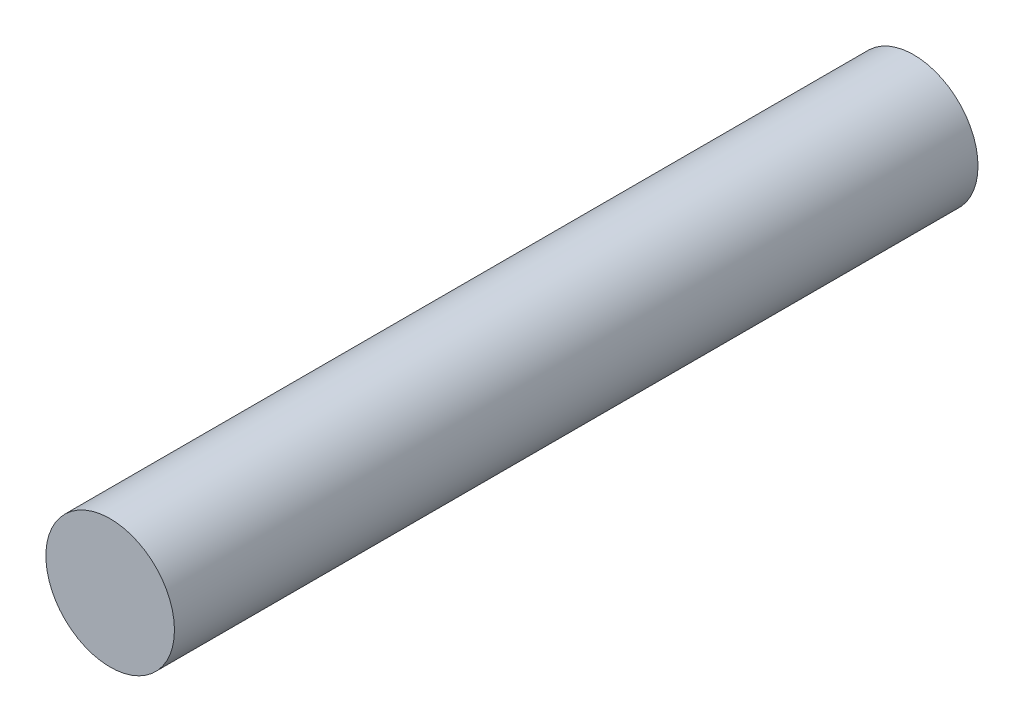
ISO-10303-21;
HEADER;
FILE_DESCRIPTION(('STEP AP214'),'2;1');
FILE_NAME('part.step','',(''),(''),'','','');
FILE_SCHEMA(('AUTOMOTIVE_DESIGN { 1 0 10303 214 1 1 1 1 }'));
ENDSEC;
DATA;
#1=APPLICATION_CONTEXT('core data for automotive mechanical design processes');
#2=APPLICATION_PROTOCOL_DEFINITION('international standard','automotive_design',2000,#1);
#3=PRODUCT_CONTEXT('',#1,'mechanical');
#4=PRODUCT('Part','Part','',(#3));
#5=PRODUCT_RELATED_PRODUCT_CATEGORY('part','',(#4));
#6=PRODUCT_DEFINITION_FORMATION('','',#4);
#7=PRODUCT_DEFINITION_CONTEXT('part definition',#1,'design');
#8=PRODUCT_DEFINITION('design','',#6,#7);
#9=PRODUCT_DEFINITION_SHAPE('','',#8);
#10=(LENGTH_UNIT() NAMED_UNIT(*) SI_UNIT(.MILLI.,.METRE.));
#11=(NAMED_UNIT(*) PLANE_ANGLE_UNIT() SI_UNIT($,.RADIAN.));
#12=(NAMED_UNIT(*) SI_UNIT($,.STERADIAN.) SOLID_ANGLE_UNIT());
#13=UNCERTAINTY_MEASURE_WITH_UNIT(LENGTH_MEASURE(1.E-05),#10,'distance_accuracy_value','');
#14=(GEOMETRIC_REPRESENTATION_CONTEXT(3) GLOBAL_UNCERTAINTY_ASSIGNED_CONTEXT((#13)) GLOBAL_UNIT_ASSIGNED_CONTEXT((#10,
#11,#12)) REPRESENTATION_CONTEXT('',''));
#15=CARTESIAN_POINT('',(0.,0.,0.));
#16=DIRECTION('',(0.,0.,1.));
#17=DIRECTION('',(1.,0.,0.));
#18=AXIS2_PLACEMENT_3D('',#15,#16,#17);
#19=CARTESIAN_POINT('',(0.,0.,100.));
#20=DIRECTION('',(0.,0.,-1.));
#21=DIRECTION('',(-1.,0.,0.));
#22=AXIS2_PLACEMENT_3D('',#19,#20,#21);
#23=CYLINDRICAL_SURFACE('',#22,8.);
#24=CARTESIAN_POINT('',(0.,0.,100.));
#25=DIRECTION('',(0.,0.,1.));
#26=DIRECTION('',(1.,0.,0.));
#27=AXIS2_PLACEMENT_3D('',#24,#25,#26);
#28=CIRCLE('',#27,8.);
#29=CARTESIAN_POINT('',(8.,0.,100.));
#30=VERTEX_POINT('',#29);
#31=EDGE_CURVE('E10',#30,#30,#28,.T.);
#32=ORIENTED_EDGE('',*,*,#31,.F.);
#33=EDGE_LOOP('',(#32));
#34=FACE_BOUND('',#33,.T.);
#35=CARTESIAN_POINT('',(0.,0.,0.));
#36=DIRECTION('',(0.,0.,1.));
#37=DIRECTION('',(1.,0.,0.));
#38=AXIS2_PLACEMENT_3D('',#35,#36,#37);
#39=CIRCLE('',#38,8.);
#40=CARTESIAN_POINT('',(8.,0.,0.));
#41=VERTEX_POINT('',#40);
#42=EDGE_CURVE('E44',#41,#41,#39,.T.);
#43=ORIENTED_EDGE('',*,*,#42,.T.);
#44=EDGE_LOOP('',(#43));
#45=FACE_BOUND('',#44,.T.);
#46=ADVANCED_FACE('F41',(#34,#45),#23,.T.);
#47=CARTESIAN_POINT('',(0.,0.,100.));
#48=DIRECTION('',(0.,0.,1.));
#49=DIRECTION('',(1.,0.,0.));
#50=AXIS2_PLACEMENT_3D('',#47,#48,#49);
#51=PLANE('',#50);
#52=ORIENTED_EDGE('',*,*,#31,.T.);
#53=EDGE_LOOP('',(#52));
#54=FACE_BOUND('',#53,.T.);
#55=ADVANCED_FACE('F58',(#54),#51,.T.);
#56=CARTESIAN_POINT('',(0.,0.,0.));
#57=DIRECTION('',(0.,0.,1.));
#58=DIRECTION('',(1.,0.,0.));
#59=AXIS2_PLACEMENT_3D('',#56,#57,#58);
#60=PLANE('',#59);
#61=ORIENTED_EDGE('',*,*,#42,.F.);
#62=EDGE_LOOP('',(#61));
#63=FACE_BOUND('',#62,.T.);
#64=ADVANCED_FACE('F56',(#63),#60,.F.);
#65=CLOSED_SHELL('',(#46,#55,#64));
#66=MANIFOLD_SOLID_BREP('B2',#65);
#67=ADVANCED_BREP_SHAPE_REPRESENTATION('',(#18,#66),#14);
#68=SHAPE_DEFINITION_REPRESENTATION(#9,#67);
ENDSEC;
END-ISO-10303-21;
